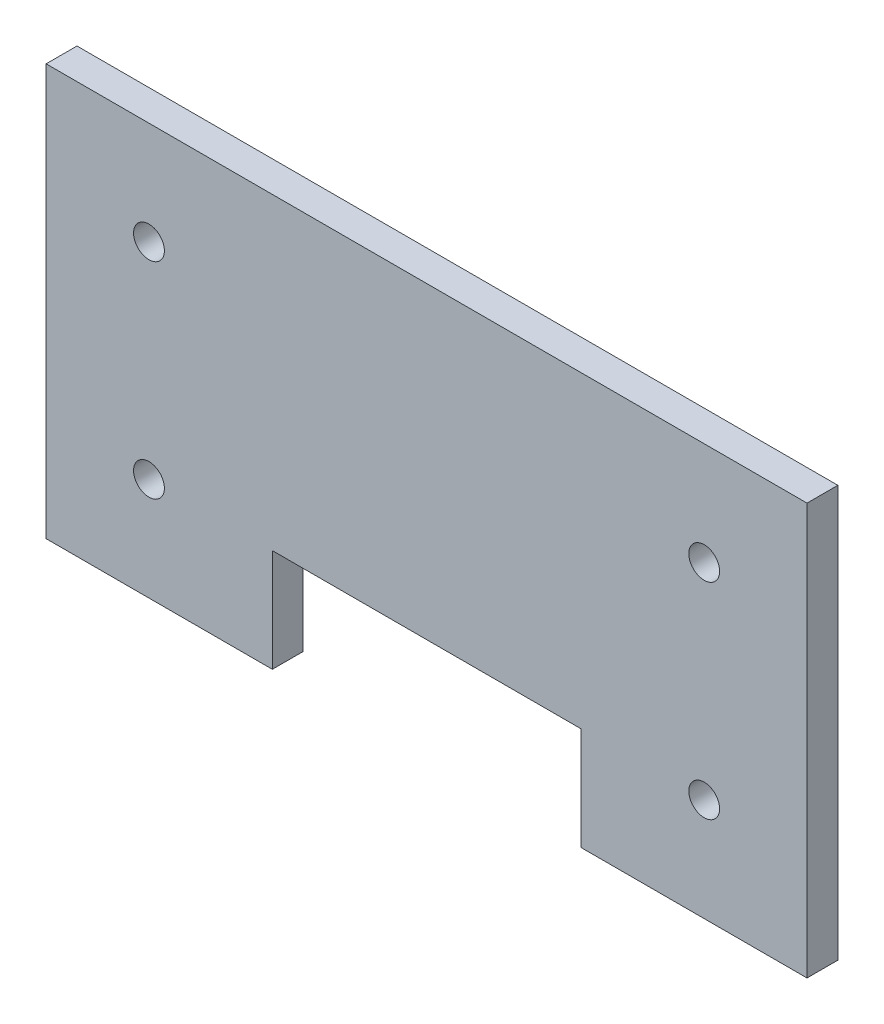
ISO-10303-21;
HEADER;
FILE_DESCRIPTION(('STEP AP214'),'2;1');
FILE_NAME('part.step','',(''),(''),'','','');
FILE_SCHEMA(('AUTOMOTIVE_DESIGN { 1 0 10303 214 1 1 1 1 }'));
ENDSEC;
DATA;
#1=APPLICATION_CONTEXT('core data for automotive mechanical design processes');
#2=APPLICATION_PROTOCOL_DEFINITION('international standard','automotive_design',2000,#1);
#3=PRODUCT_CONTEXT('',#1,'mechanical');
#4=PRODUCT('Part','Part','',(#3));
#5=PRODUCT_RELATED_PRODUCT_CATEGORY('part','',(#4));
#6=PRODUCT_DEFINITION_FORMATION('','',#4);
#7=PRODUCT_DEFINITION_CONTEXT('part definition',#1,'design');
#8=PRODUCT_DEFINITION('design','',#6,#7);
#9=PRODUCT_DEFINITION_SHAPE('','',#8);
#10=(LENGTH_UNIT() NAMED_UNIT(*) SI_UNIT(.MILLI.,.METRE.));
#11=(NAMED_UNIT(*) PLANE_ANGLE_UNIT() SI_UNIT($,.RADIAN.));
#12=(NAMED_UNIT(*) SI_UNIT($,.STERADIAN.) SOLID_ANGLE_UNIT());
#13=UNCERTAINTY_MEASURE_WITH_UNIT(LENGTH_MEASURE(1.E-05),#10,'distance_accuracy_value','');
#14=(GEOMETRIC_REPRESENTATION_CONTEXT(3) GLOBAL_UNCERTAINTY_ASSIGNED_CONTEXT((#13)) GLOBAL_UNIT_ASSIGNED_CONTEXT((#10,
#11,#12)) REPRESENTATION_CONTEXT('',''));
#15=CARTESIAN_POINT('',(0.,0.,0.));
#16=DIRECTION('',(0.,0.,1.));
#17=DIRECTION('',(1.,0.,0.));
#18=AXIS2_PLACEMENT_3D('',#15,#16,#17);
#19=CARTESIAN_POINT('',(0.,-10.,3.));
#20=DIRECTION('',(0.,1.,0.));
#21=DIRECTION('',(0.,0.,1.));
#22=AXIS2_PLACEMENT_3D('',#19,#20,#21);
#23=PLANE('',#22);
#24=DIRECTION('',(1.,0.,0.));
#25=VECTOR('',#24,1.);
#26=CARTESIAN_POINT('',(0.,-10.,0.));
#27=LINE('',#26,#25);
#28=CARTESIAN_POINT('',(-15.,-10.,0.));
#29=VERTEX_POINT('',#28);
#30=CARTESIAN_POINT('',(15.,-10.,0.));
#31=VERTEX_POINT('',#30);
#32=EDGE_CURVE('E211',#29,#31,#27,.T.);
#33=ORIENTED_EDGE('',*,*,#32,.T.);
#34=DIRECTION('',(0.,0.,-1.));
#35=VECTOR('',#34,1.);
#36=CARTESIAN_POINT('',(15.,-10.,3.));
#37=LINE('',#36,#35);
#38=CARTESIAN_POINT('',(15.,-10.,3.));
#39=VERTEX_POINT('',#38);
#40=EDGE_CURVE('E11',#39,#31,#37,.T.);
#41=ORIENTED_EDGE('',*,*,#40,.F.);
#42=DIRECTION('',(1.,0.,0.));
#43=VECTOR('',#42,1.);
#44=CARTESIAN_POINT('',(0.,-10.,3.));
#45=LINE('',#44,#43);
#46=CARTESIAN_POINT('',(-15.,-10.,3.));
#47=VERTEX_POINT('',#46);
#48=EDGE_CURVE('E150',#47,#39,#45,.T.);
#49=ORIENTED_EDGE('',*,*,#48,.F.);
#50=DIRECTION('',(0.,0.,-1.));
#51=VECTOR('',#50,1.);
#52=CARTESIAN_POINT('',(-15.,-10.,3.));
#53=LINE('',#52,#51);
#54=EDGE_CURVE('E57',#47,#29,#53,.T.);
#55=ORIENTED_EDGE('',*,*,#54,.T.);
#56=EDGE_LOOP('',(#33,#41,#49,#55));
#57=FACE_BOUND('',#56,.T.);
#58=ADVANCED_FACE('F39',(#57),#23,.F.);
#59=CARTESIAN_POINT('',(15.,0.,3.));
#60=DIRECTION('',(1.,0.,0.));
#61=DIRECTION('',(0.,0.,-1.));
#62=AXIS2_PLACEMENT_3D('',#59,#60,#61);
#63=PLANE('',#62);
#64=DIRECTION('',(0.,-1.,0.));
#65=VECTOR('',#64,1.);
#66=CARTESIAN_POINT('',(15.,0.,0.));
#67=LINE('',#66,#65);
#68=CARTESIAN_POINT('',(15.,-20.,0.));
#69=VERTEX_POINT('',#68);
#70=EDGE_CURVE('E202',#31,#69,#67,.T.);
#71=ORIENTED_EDGE('',*,*,#70,.T.);
#72=DIRECTION('',(0.,0.,-1.));
#73=VECTOR('',#72,1.);
#74=CARTESIAN_POINT('',(15.,-20.,3.));
#75=LINE('',#74,#73);
#76=CARTESIAN_POINT('',(15.,-20.,3.));
#77=VERTEX_POINT('',#76);
#78=EDGE_CURVE('E49',#77,#69,#75,.T.);
#79=ORIENTED_EDGE('',*,*,#78,.F.);
#80=DIRECTION('',(0.,-1.,0.));
#81=VECTOR('',#80,1.);
#82=CARTESIAN_POINT('',(15.,0.,3.));
#83=LINE('',#82,#81);
#84=EDGE_CURVE('E96',#39,#77,#83,.T.);
#85=ORIENTED_EDGE('',*,*,#84,.F.);
#86=ORIENTED_EDGE('',*,*,#40,.T.);
#87=EDGE_LOOP('',(#71,#79,#85,#86));
#88=FACE_BOUND('',#87,.T.);
#89=ADVANCED_FACE('F228',(#88),#63,.F.);
#90=CARTESIAN_POINT('',(0.,-20.,3.));
#91=DIRECTION('',(0.,1.,0.));
#92=DIRECTION('',(0.,0.,1.));
#93=AXIS2_PLACEMENT_3D('',#90,#91,#92);
#94=PLANE('',#93);
#95=DIRECTION('',(1.,0.,0.));
#96=VECTOR('',#95,1.);
#97=CARTESIAN_POINT('',(0.,-20.,0.));
#98=LINE('',#97,#96);
#99=CARTESIAN_POINT('',(37.,-20.,0.));
#100=VERTEX_POINT('',#99);
#101=EDGE_CURVE('E179',#69,#100,#98,.T.);
#102=ORIENTED_EDGE('',*,*,#101,.T.);
#103=DIRECTION('',(0.,0.,-1.));
#104=VECTOR('',#103,1.);
#105=CARTESIAN_POINT('',(37.,-20.,3.));
#106=LINE('',#105,#104);
#107=CARTESIAN_POINT('',(37.,-20.,3.));
#108=VERTEX_POINT('',#107);
#109=EDGE_CURVE('E192',#108,#100,#106,.T.);
#110=ORIENTED_EDGE('',*,*,#109,.F.);
#111=DIRECTION('',(1.,0.,0.));
#112=VECTOR('',#111,1.);
#113=CARTESIAN_POINT('',(0.,-20.,3.));
#114=LINE('',#113,#112);
#115=EDGE_CURVE('E138',#77,#108,#114,.T.);
#116=ORIENTED_EDGE('',*,*,#115,.F.);
#117=ORIENTED_EDGE('',*,*,#78,.T.);
#118=EDGE_LOOP('',(#102,#110,#116,#117));
#119=FACE_BOUND('',#118,.T.);
#120=ADVANCED_FACE('F199',(#119),#94,.F.);
#121=CARTESIAN_POINT('',(37.,0.,3.));
#122=DIRECTION('',(1.,0.,0.));
#123=DIRECTION('',(0.,0.,-1.));
#124=AXIS2_PLACEMENT_3D('',#121,#122,#123);
#125=PLANE('',#124);
#126=DIRECTION('',(0.,-1.,0.));
#127=VECTOR('',#126,1.);
#128=CARTESIAN_POINT('',(37.,0.,0.));
#129=LINE('',#128,#127);
#130=CARTESIAN_POINT('',(37.,20.,0.));
#131=VERTEX_POINT('',#130);
#132=EDGE_CURVE('E205',#131,#100,#129,.T.);
#133=ORIENTED_EDGE('',*,*,#132,.F.);
#134=DIRECTION('',(0.,0.,-1.));
#135=VECTOR('',#134,1.);
#136=CARTESIAN_POINT('',(37.,20.,3.));
#137=LINE('',#136,#135);
#138=CARTESIAN_POINT('',(37.,20.,3.));
#139=VERTEX_POINT('',#138);
#140=EDGE_CURVE('E189',#139,#131,#137,.T.);
#141=ORIENTED_EDGE('',*,*,#140,.F.);
#142=DIRECTION('',(0.,-1.,0.));
#143=VECTOR('',#142,1.);
#144=CARTESIAN_POINT('',(37.,0.,3.));
#145=LINE('',#144,#143);
#146=EDGE_CURVE('E144',#139,#108,#145,.T.);
#147=ORIENTED_EDGE('',*,*,#146,.T.);
#148=ORIENTED_EDGE('',*,*,#109,.T.);
#149=EDGE_LOOP('',(#133,#141,#147,#148));
#150=FACE_BOUND('',#149,.T.);
#151=ADVANCED_FACE('F220',(#150),#125,.T.);
#152=CARTESIAN_POINT('',(0.,20.,3.));
#153=DIRECTION('',(0.,1.,0.));
#154=DIRECTION('',(0.,0.,1.));
#155=AXIS2_PLACEMENT_3D('',#152,#153,#154);
#156=PLANE('',#155);
#157=DIRECTION('',(1.,0.,0.));
#158=VECTOR('',#157,1.);
#159=CARTESIAN_POINT('',(0.,20.,0.));
#160=LINE('',#159,#158);
#161=CARTESIAN_POINT('',(-37.,20.,0.));
#162=VERTEX_POINT('',#161);
#163=EDGE_CURVE('E209',#162,#131,#160,.T.);
#164=ORIENTED_EDGE('',*,*,#163,.F.);
#165=DIRECTION('',(0.,0.,-1.));
#166=VECTOR('',#165,1.);
#167=CARTESIAN_POINT('',(-37.,20.,3.));
#168=LINE('',#167,#166);
#169=CARTESIAN_POINT('',(-37.,20.,3.));
#170=VERTEX_POINT('',#169);
#171=EDGE_CURVE('E132',#170,#162,#168,.T.);
#172=ORIENTED_EDGE('',*,*,#171,.F.);
#173=DIRECTION('',(1.,0.,0.));
#174=VECTOR('',#173,1.);
#175=CARTESIAN_POINT('',(0.,20.,3.));
#176=LINE('',#175,#174);
#177=EDGE_CURVE('E120',#170,#139,#176,.T.);
#178=ORIENTED_EDGE('',*,*,#177,.T.);
#179=ORIENTED_EDGE('',*,*,#140,.T.);
#180=EDGE_LOOP('',(#164,#172,#178,#179));
#181=FACE_BOUND('',#180,.T.);
#182=ADVANCED_FACE('F218',(#181),#156,.T.);
#183=CARTESIAN_POINT('',(-37.,0.,3.));
#184=DIRECTION('',(1.,0.,0.));
#185=DIRECTION('',(0.,1.,0.));
#186=AXIS2_PLACEMENT_3D('',#183,#184,#185);
#187=PLANE('',#186);
#188=DIRECTION('',(0.,-1.,0.));
#189=VECTOR('',#188,1.);
#190=CARTESIAN_POINT('',(-37.,0.,0.));
#191=LINE('',#190,#189);
#192=CARTESIAN_POINT('',(-37.,-20.,0.));
#193=VERTEX_POINT('',#192);
#194=EDGE_CURVE('E128',#162,#193,#191,.T.);
#195=ORIENTED_EDGE('',*,*,#194,.T.);
#196=DIRECTION('',(0.,0.,-1.));
#197=VECTOR('',#196,1.);
#198=CARTESIAN_POINT('',(-37.,-20.,3.));
#199=LINE('',#198,#197);
#200=CARTESIAN_POINT('',(-37.,-20.,3.));
#201=VERTEX_POINT('',#200);
#202=EDGE_CURVE('E125',#201,#193,#199,.T.);
#203=ORIENTED_EDGE('',*,*,#202,.F.);
#204=DIRECTION('',(0.,-1.,0.));
#205=VECTOR('',#204,1.);
#206=CARTESIAN_POINT('',(-37.,0.,3.));
#207=LINE('',#206,#205);
#208=EDGE_CURVE('E112',#170,#201,#207,.T.);
#209=ORIENTED_EDGE('',*,*,#208,.F.);
#210=ORIENTED_EDGE('',*,*,#171,.T.);
#211=EDGE_LOOP('',(#195,#203,#209,#210));
#212=FACE_BOUND('',#211,.T.);
#213=ADVANCED_FACE('F126',(#212),#187,.F.);
#214=CARTESIAN_POINT('',(-15.,-20.,0.));
#215=VERTEX_POINT('',#214);
#216=EDGE_CURVE('E174',#193,#215,#98,.T.);
#217=ORIENTED_EDGE('',*,*,#216,.T.);
#218=DIRECTION('',(0.,0.,-1.));
#219=VECTOR('',#218,1.);
#220=CARTESIAN_POINT('',(-15.,-20.,3.));
#221=LINE('',#220,#219);
#222=CARTESIAN_POINT('',(-15.,-20.,3.));
#223=VERTEX_POINT('',#222);
#224=EDGE_CURVE('E84',#223,#215,#221,.T.);
#225=ORIENTED_EDGE('',*,*,#224,.F.);
#226=EDGE_CURVE('E117',#201,#223,#114,.T.);
#227=ORIENTED_EDGE('',*,*,#226,.F.);
#228=ORIENTED_EDGE('',*,*,#202,.T.);
#229=EDGE_LOOP('',(#217,#225,#227,#228));
#230=FACE_BOUND('',#229,.T.);
#231=ADVANCED_FACE('F134',(#230),#94,.F.);
#232=CARTESIAN_POINT('',(-27.,10.,3.));
#233=DIRECTION('',(0.,0.,-1.));
#234=DIRECTION('',(-1.,0.,0.));
#235=AXIS2_PLACEMENT_3D('',#232,#233,#234);
#236=CYLINDRICAL_SURFACE('',#235,1.5);
#237=CARTESIAN_POINT('',(-27.,10.,3.));
#238=DIRECTION('',(0.,0.,1.));
#239=DIRECTION('',(1.,0.,0.));
#240=AXIS2_PLACEMENT_3D('',#237,#238,#239);
#241=CIRCLE('',#240,1.5);
#242=CARTESIAN_POINT('',(-25.5,10.,3.));
#243=VERTEX_POINT('',#242);
#244=EDGE_CURVE('E152',#243,#243,#241,.T.);
#245=ORIENTED_EDGE('',*,*,#244,.T.);
#246=EDGE_LOOP('',(#245));
#247=FACE_BOUND('',#246,.T.);
#248=CARTESIAN_POINT('',(-27.,10.,0.));
#249=DIRECTION('',(0.,0.,1.));
#250=DIRECTION('',(1.,0.,0.));
#251=AXIS2_PLACEMENT_3D('',#248,#249,#250);
#252=CIRCLE('',#251,1.5);
#253=CARTESIAN_POINT('',(-25.5,10.,0.));
#254=VERTEX_POINT('',#253);
#255=EDGE_CURVE('E264',#254,#254,#252,.T.);
#256=ORIENTED_EDGE('',*,*,#255,.F.);
#257=EDGE_LOOP('',(#256));
#258=FACE_BOUND('',#257,.T.);
#259=ADVANCED_FACE('F237',(#247,#258),#236,.F.);
#260=CARTESIAN_POINT('',(-27.,-10.,3.));
#261=DIRECTION('',(0.,0.,-1.));
#262=DIRECTION('',(-1.,0.,0.));
#263=AXIS2_PLACEMENT_3D('',#260,#261,#262);
#264=CYLINDRICAL_SURFACE('',#263,1.5);
#265=CARTESIAN_POINT('',(-27.,-10.,3.));
#266=DIRECTION('',(0.,0.,1.));
#267=DIRECTION('',(1.,0.,0.));
#268=AXIS2_PLACEMENT_3D('',#265,#266,#267);
#269=CIRCLE('',#268,1.5);
#270=CARTESIAN_POINT('',(-25.5,-10.,3.));
#271=VERTEX_POINT('',#270);
#272=EDGE_CURVE('E158',#271,#271,#269,.T.);
#273=ORIENTED_EDGE('',*,*,#272,.T.);
#274=EDGE_LOOP('',(#273));
#275=FACE_BOUND('',#274,.T.);
#276=CARTESIAN_POINT('',(-27.,-10.,0.));
#277=DIRECTION('',(0.,0.,1.));
#278=DIRECTION('',(1.,0.,0.));
#279=AXIS2_PLACEMENT_3D('',#276,#277,#278);
#280=CIRCLE('',#279,1.5);
#281=CARTESIAN_POINT('',(-25.5,-10.,0.));
#282=VERTEX_POINT('',#281);
#283=EDGE_CURVE('E258',#282,#282,#280,.T.);
#284=ORIENTED_EDGE('',*,*,#283,.F.);
#285=EDGE_LOOP('',(#284));
#286=FACE_BOUND('',#285,.T.);
#287=ADVANCED_FACE('F240',(#275,#286),#264,.F.);
#288=CARTESIAN_POINT('',(27.,10.,3.));
#289=DIRECTION('',(0.,0.,-1.));
#290=DIRECTION('',(-1.,0.,0.));
#291=AXIS2_PLACEMENT_3D('',#288,#289,#290);
#292=CYLINDRICAL_SURFACE('',#291,1.5);
#293=CARTESIAN_POINT('',(27.,10.,3.));
#294=DIRECTION('',(0.,0.,1.));
#295=DIRECTION('',(1.,0.,0.));
#296=AXIS2_PLACEMENT_3D('',#293,#294,#295);
#297=CIRCLE('',#296,1.5);
#298=CARTESIAN_POINT('',(28.5,10.,3.));
#299=VERTEX_POINT('',#298);
#300=EDGE_CURVE('E162',#299,#299,#297,.T.);
#301=ORIENTED_EDGE('',*,*,#300,.T.);
#302=EDGE_LOOP('',(#301));
#303=FACE_BOUND('',#302,.T.);
#304=CARTESIAN_POINT('',(27.,10.,0.));
#305=DIRECTION('',(0.,0.,1.));
#306=DIRECTION('',(1.,0.,0.));
#307=AXIS2_PLACEMENT_3D('',#304,#305,#306);
#308=CIRCLE('',#307,1.5);
#309=CARTESIAN_POINT('',(28.5,10.,0.));
#310=VERTEX_POINT('',#309);
#311=EDGE_CURVE('E255',#310,#310,#308,.T.);
#312=ORIENTED_EDGE('',*,*,#311,.F.);
#313=EDGE_LOOP('',(#312));
#314=FACE_BOUND('',#313,.T.);
#315=ADVANCED_FACE('F243',(#303,#314),#292,.F.);
#316=CARTESIAN_POINT('',(27.,-10.,3.));
#317=DIRECTION('',(0.,0.,-1.));
#318=DIRECTION('',(-1.,0.,0.));
#319=AXIS2_PLACEMENT_3D('',#316,#317,#318);
#320=CYLINDRICAL_SURFACE('',#319,1.5);
#321=CARTESIAN_POINT('',(27.,-10.,3.));
#322=DIRECTION('',(0.,0.,1.));
#323=DIRECTION('',(1.,0.,0.));
#324=AXIS2_PLACEMENT_3D('',#321,#322,#323);
#325=CIRCLE('',#324,1.5);
#326=CARTESIAN_POINT('',(28.5,-10.,3.));
#327=VERTEX_POINT('',#326);
#328=EDGE_CURVE('E166',#327,#327,#325,.T.);
#329=ORIENTED_EDGE('',*,*,#328,.T.);
#330=EDGE_LOOP('',(#329));
#331=FACE_BOUND('',#330,.T.);
#332=CARTESIAN_POINT('',(27.,-10.,0.));
#333=DIRECTION('',(0.,0.,1.));
#334=DIRECTION('',(1.,0.,0.));
#335=AXIS2_PLACEMENT_3D('',#332,#333,#334);
#336=CIRCLE('',#335,1.5);
#337=CARTESIAN_POINT('',(28.5,-10.,0.));
#338=VERTEX_POINT('',#337);
#339=EDGE_CURVE('E259',#338,#338,#336,.T.);
#340=ORIENTED_EDGE('',*,*,#339,.F.);
#341=EDGE_LOOP('',(#340));
#342=FACE_BOUND('',#341,.T.);
#343=ADVANCED_FACE('F41',(#331,#342),#320,.F.);
#344=CARTESIAN_POINT('',(-15.,0.,3.));
#345=DIRECTION('',(1.,0.,0.));
#346=DIRECTION('',(0.,1.,0.));
#347=AXIS2_PLACEMENT_3D('',#344,#345,#346);
#348=PLANE('',#347);
#349=DIRECTION('',(0.,-1.,0.));
#350=VECTOR('',#349,1.);
#351=CARTESIAN_POINT('',(-15.,0.,0.));
#352=LINE('',#351,#350);
#353=EDGE_CURVE('E169',#29,#215,#352,.T.);
#354=ORIENTED_EDGE('',*,*,#353,.F.);
#355=ORIENTED_EDGE('',*,*,#54,.F.);
#356=DIRECTION('',(0.,-1.,0.));
#357=VECTOR('',#356,1.);
#358=CARTESIAN_POINT('',(-15.,0.,3.));
#359=LINE('',#358,#357);
#360=EDGE_CURVE('E136',#47,#223,#359,.T.);
#361=ORIENTED_EDGE('',*,*,#360,.T.);
#362=ORIENTED_EDGE('',*,*,#224,.T.);
#363=EDGE_LOOP('',(#354,#355,#361,#362));
#364=FACE_BOUND('',#363,.T.);
#365=ADVANCED_FACE('F250',(#364),#348,.T.);
#366=CARTESIAN_POINT('',(0.,0.,3.));
#367=DIRECTION('',(0.,0.,1.));
#368=DIRECTION('',(1.,0.,0.));
#369=AXIS2_PLACEMENT_3D('',#366,#367,#368);
#370=PLANE('',#369);
#371=ORIENTED_EDGE('',*,*,#328,.F.);
#372=EDGE_LOOP('',(#371));
#373=FACE_BOUND('',#372,.T.);
#374=ORIENTED_EDGE('',*,*,#300,.F.);
#375=EDGE_LOOP('',(#374));
#376=FACE_BOUND('',#375,.T.);
#377=ORIENTED_EDGE('',*,*,#272,.F.);
#378=EDGE_LOOP('',(#377));
#379=FACE_BOUND('',#378,.T.);
#380=ORIENTED_EDGE('',*,*,#244,.F.);
#381=EDGE_LOOP('',(#380));
#382=FACE_BOUND('',#381,.T.);
#383=ORIENTED_EDGE('',*,*,#48,.T.);
#384=ORIENTED_EDGE('',*,*,#84,.T.);
#385=ORIENTED_EDGE('',*,*,#115,.T.);
#386=ORIENTED_EDGE('',*,*,#146,.F.);
#387=ORIENTED_EDGE('',*,*,#177,.F.);
#388=ORIENTED_EDGE('',*,*,#208,.T.);
#389=ORIENTED_EDGE('',*,*,#226,.T.);
#390=ORIENTED_EDGE('',*,*,#360,.F.);
#391=EDGE_LOOP('',(#383,#384,#385,#386,#387,#388,#389,#390));
#392=FACE_BOUND('',#391,.T.);
#393=ADVANCED_FACE('F114',(#373,#376,#379,#382,#392),#370,.T.);
#394=CARTESIAN_POINT('',(0.,0.,0.));
#395=DIRECTION('',(0.,0.,1.));
#396=DIRECTION('',(1.,0.,0.));
#397=AXIS2_PLACEMENT_3D('',#394,#395,#396);
#398=PLANE('',#397);
#399=ORIENTED_EDGE('',*,*,#339,.T.);
#400=EDGE_LOOP('',(#399));
#401=FACE_BOUND('',#400,.T.);
#402=ORIENTED_EDGE('',*,*,#311,.T.);
#403=EDGE_LOOP('',(#402));
#404=FACE_BOUND('',#403,.T.);
#405=ORIENTED_EDGE('',*,*,#283,.T.);
#406=EDGE_LOOP('',(#405));
#407=FACE_BOUND('',#406,.T.);
#408=ORIENTED_EDGE('',*,*,#255,.T.);
#409=EDGE_LOOP('',(#408));
#410=FACE_BOUND('',#409,.T.);
#411=ORIENTED_EDGE('',*,*,#32,.F.);
#412=ORIENTED_EDGE('',*,*,#353,.T.);
#413=ORIENTED_EDGE('',*,*,#216,.F.);
#414=ORIENTED_EDGE('',*,*,#194,.F.);
#415=ORIENTED_EDGE('',*,*,#163,.T.);
#416=ORIENTED_EDGE('',*,*,#132,.T.);
#417=ORIENTED_EDGE('',*,*,#101,.F.);
#418=ORIENTED_EDGE('',*,*,#70,.F.);
#419=EDGE_LOOP('',(#411,#412,#413,#414,#415,#416,#417,#418));
#420=FACE_BOUND('',#419,.T.);
#421=ADVANCED_FACE('F201',(#401,#404,#407,#410,#420),#398,.F.);
#422=CLOSED_SHELL('',(#58,#89,#120,#151,#182,#213,#231,#259,#287,#315,#343,#365,#393,#421));
#423=MANIFOLD_SOLID_BREP('B2',#422);
#424=ADVANCED_BREP_SHAPE_REPRESENTATION('',(#18,#423),#14);
#425=SHAPE_DEFINITION_REPRESENTATION(#9,#424);
ENDSEC;
END-ISO-10303-21;
